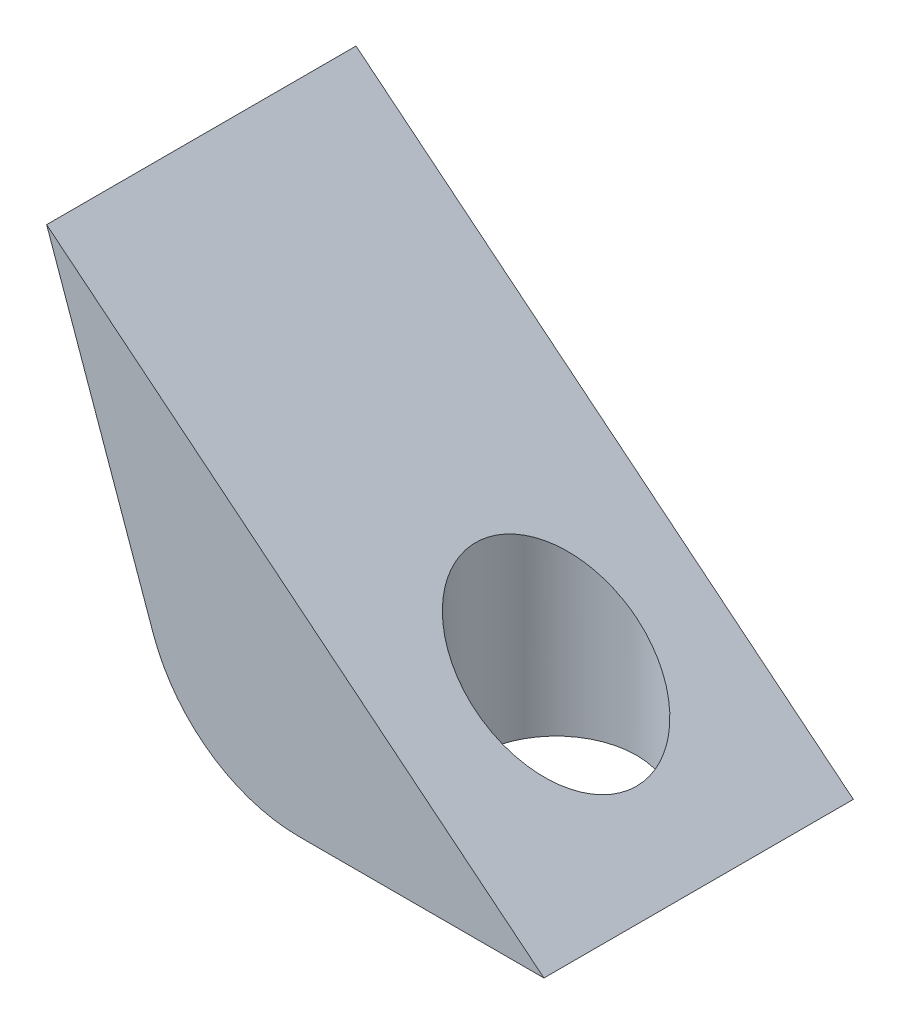
ISO-10303-21;
HEADER;
FILE_DESCRIPTION(('STEP AP214'),'2;1');
FILE_NAME('part.step','',(''),(''),'','','');
FILE_SCHEMA(('AUTOMOTIVE_DESIGN { 1 0 10303 214 1 1 1 1 }'));
ENDSEC;
DATA;
#1=APPLICATION_CONTEXT('core data for automotive mechanical design processes');
#2=APPLICATION_PROTOCOL_DEFINITION('international standard','automotive_design',2000,#1);
#3=PRODUCT_CONTEXT('',#1,'mechanical');
#4=PRODUCT('Part','Part','',(#3));
#5=PRODUCT_RELATED_PRODUCT_CATEGORY('part','',(#4));
#6=PRODUCT_DEFINITION_FORMATION('','',#4);
#7=PRODUCT_DEFINITION_CONTEXT('part definition',#1,'design');
#8=PRODUCT_DEFINITION('design','',#6,#7);
#9=PRODUCT_DEFINITION_SHAPE('','',#8);
#10=(LENGTH_UNIT() NAMED_UNIT(*) SI_UNIT(.MILLI.,.METRE.));
#11=(NAMED_UNIT(*) PLANE_ANGLE_UNIT() SI_UNIT($,.RADIAN.));
#12=(NAMED_UNIT(*) SI_UNIT($,.STERADIAN.) SOLID_ANGLE_UNIT());
#13=UNCERTAINTY_MEASURE_WITH_UNIT(LENGTH_MEASURE(1.E-05),#10,'distance_accuracy_value','');
#14=(GEOMETRIC_REPRESENTATION_CONTEXT(3) GLOBAL_UNCERTAINTY_ASSIGNED_CONTEXT((#13)) GLOBAL_UNIT_ASSIGNED_CONTEXT((#10,
#11,#12)) REPRESENTATION_CONTEXT('',''));
#15=CARTESIAN_POINT('',(0.,0.,0.));
#16=DIRECTION('',(0.,0.,1.));
#17=DIRECTION('',(1.,0.,0.));
#18=AXIS2_PLACEMENT_3D('',#15,#16,#17);
#19=CARTESIAN_POINT('',(0.,0.,10.));
#20=DIRECTION('',(0.942599536242421,0.333925312421165,0.));
#21=DIRECTION('',(-0.333925312421165,0.942599536242421,0.));
#22=AXIS2_PLACEMENT_3D('',#19,#20,#21);
#23=PLANE('',#22);
#24=DIRECTION('',(0.333925312421165,-0.942599536242421,0.));
#25=VECTOR('',#24,1.);
#26=CARTESIAN_POINT('',(0.,0.,0.));
#27=LINE('',#26,#25);
#28=CARTESIAN_POINT('',(-4.62309300985638,13.05,0.));
#29=VERTEX_POINT('',#28);
#30=CARTESIAN_POINT('',(-1.17981809662375,3.33037343789417,0.));
#31=VERTEX_POINT('',#30);
#32=EDGE_CURVE('E111',#29,#31,#27,.T.);
#33=ORIENTED_EDGE('',*,*,#32,.T.);
#34=DIRECTION('',(0.,0.,-1.));
#35=VECTOR('',#34,1.);
#36=CARTESIAN_POINT('',(-1.17981809662375,3.33037343789417,10.));
#37=LINE('',#36,#35);
#38=CARTESIAN_POINT('',(-1.17981809662375,3.33037343789417,10.));
#39=VERTEX_POINT('',#38);
#40=EDGE_CURVE('E48',#31,#39,#37,.F.);
#41=ORIENTED_EDGE('',*,*,#40,.T.);
#42=DIRECTION('',(0.333925312421165,-0.942599536242421,0.));
#43=VECTOR('',#42,1.);
#44=CARTESIAN_POINT('',(0.,0.,10.));
#45=LINE('',#44,#43);
#46=CARTESIAN_POINT('',(-4.62309300985638,13.05,10.));
#47=VERTEX_POINT('',#46);
#48=EDGE_CURVE('E91',#47,#39,#45,.T.);
#49=ORIENTED_EDGE('',*,*,#48,.F.);
#50=DIRECTION('',(0.,0.,-1.));
#51=VECTOR('',#50,1.);
#52=CARTESIAN_POINT('',(-4.62309300985638,13.05,10.));
#53=LINE('',#52,#51);
#54=EDGE_CURVE('E101',#47,#29,#53,.T.);
#55=ORIENTED_EDGE('',*,*,#54,.T.);
#56=EDGE_LOOP('',(#33,#41,#49,#55));
#57=FACE_BOUND('',#56,.T.);
#58=ADVANCED_FACE('F38',(#57),#23,.F.);
#59=CARTESIAN_POINT('',(0.,0.,10.));
#60=DIRECTION('',(0.,1.,0.));
#61=DIRECTION('',(0.,0.,1.));
#62=AXIS2_PLACEMENT_3D('',#59,#60,#61);
#63=PLANE('',#62);
#64=CARTESIAN_POINT('',(6.71317958458835,0.,4.87));
#65=DIRECTION('',(0.,-1.,0.));
#66=DIRECTION('',(0.,0.,-1.));
#67=AXIS2_PLACEMENT_3D('',#64,#65,#66);
#68=CIRCLE('',#67,2.6);
#69=CARTESIAN_POINT('',(6.71317958458835,0.,2.27));
#70=VERTEX_POINT('',#69);
#71=EDGE_CURVE('E128',#70,#70,#68,.T.);
#72=ORIENTED_EDGE('',*,*,#71,.F.);
#73=EDGE_LOOP('',(#72));
#74=FACE_BOUND('',#73,.T.);
#75=DIRECTION('',(1.,0.,0.));
#76=VECTOR('',#75,1.);
#77=CARTESIAN_POINT('',(0.,0.,10.));
#78=LINE('',#77,#76);
#79=CARTESIAN_POINT('',(3.53317958458836,0.,10.));
#80=VERTEX_POINT('',#79);
#81=CARTESIAN_POINT('',(11.45,0.,10.));
#82=VERTEX_POINT('',#81);
#83=EDGE_CURVE('E80',#80,#82,#78,.T.);
#84=ORIENTED_EDGE('',*,*,#83,.F.);
#85=DIRECTION('',(0.,0.,-1.));
#86=VECTOR('',#85,1.);
#87=CARTESIAN_POINT('',(3.53317958458836,0.,10.));
#88=LINE('',#87,#86);
#89=CARTESIAN_POINT('',(3.53317958458836,0.,0.));
#90=VERTEX_POINT('',#89);
#91=EDGE_CURVE('E100',#80,#90,#88,.T.);
#92=ORIENTED_EDGE('',*,*,#91,.T.);
#93=DIRECTION('',(1.,0.,0.));
#94=VECTOR('',#93,1.);
#95=CARTESIAN_POINT('',(0.,0.,0.));
#96=LINE('',#95,#94);
#97=CARTESIAN_POINT('',(11.45,0.,0.));
#98=VERTEX_POINT('',#97);
#99=EDGE_CURVE('E96',#90,#98,#96,.T.);
#100=ORIENTED_EDGE('',*,*,#99,.T.);
#101=DIRECTION('',(0.,0.,-1.));
#102=VECTOR('',#101,1.);
#103=CARTESIAN_POINT('',(11.45,0.,10.));
#104=LINE('',#103,#102);
#105=EDGE_CURVE('E94',#82,#98,#104,.T.);
#106=ORIENTED_EDGE('',*,*,#105,.F.);
#107=EDGE_LOOP('',(#84,#92,#100,#106));
#108=FACE_BOUND('',#107,.T.);
#109=ADVANCED_FACE('F95',(#74,#108),#63,.F.);
#110=CARTESIAN_POINT('',(-4.62309300985638,13.05,10.));
#111=DIRECTION('',(-0.630319450905653,-0.776335874354648,0.));
#112=DIRECTION('',(0.776335874354648,-0.630319450905653,0.));
#113=AXIS2_PLACEMENT_3D('',#110,#111,#112);
#114=PLANE('',#113);
#115=CARTESIAN_POINT('',(6.71317958458835,3.84589987647152,4.87));
#116=DIRECTION('',(-0.630319450905653,-0.776335874354648,0.));
#117=DIRECTION('',(0.776335874354648,-0.630319450905653,0.));
#118=AXIS2_PLACEMENT_3D('',#115,#116,#117);
#119=ELLIPSE('',#118,3.3490658951724,2.6);
#120=CARTESIAN_POINT('',(9.31317958458835,1.73491850037961,4.87));
#121=VERTEX_POINT('',#120);
#122=EDGE_CURVE('E42',#121,#121,#119,.T.);
#123=ORIENTED_EDGE('',*,*,#122,.T.);
#124=EDGE_LOOP('',(#123));
#125=FACE_BOUND('',#124,.T.);
#126=DIRECTION('',(-0.776335874354648,0.630319450905653,0.));
#127=VECTOR('',#126,1.);
#128=CARTESIAN_POINT('',(-4.62309300985638,13.05,0.));
#129=LINE('',#128,#127);
#130=EDGE_CURVE('E116',#98,#29,#129,.T.);
#131=ORIENTED_EDGE('',*,*,#130,.T.);
#132=ORIENTED_EDGE('',*,*,#54,.F.);
#133=DIRECTION('',(-0.776335874354648,0.630319450905653,0.));
#134=VECTOR('',#133,1.);
#135=CARTESIAN_POINT('',(-4.62309300985638,13.05,10.));
#136=LINE('',#135,#134);
#137=EDGE_CURVE('E84',#82,#47,#136,.T.);
#138=ORIENTED_EDGE('',*,*,#137,.F.);
#139=ORIENTED_EDGE('',*,*,#105,.T.);
#140=EDGE_LOOP('',(#131,#132,#138,#139));
#141=FACE_BOUND('',#140,.T.);
#142=ADVANCED_FACE('F103',(#125,#141),#114,.F.);
#143=CARTESIAN_POINT('',(0.,0.,10.));
#144=DIRECTION('',(0.,0.,-1.));
#145=DIRECTION('',(-1.,0.,0.));
#146=AXIS2_PLACEMENT_3D('',#143,#144,#145);
#147=PLANE('',#146);
#148=ORIENTED_EDGE('',*,*,#48,.T.);
#149=CARTESIAN_POINT('',(3.53317958458836,5.,10.));
#150=DIRECTION('',(0.,0.,-1.));
#151=DIRECTION('',(-1.,0.,0.));
#152=AXIS2_PLACEMENT_3D('',#149,#150,#151);
#153=CIRCLE('',#152,5.);
#154=EDGE_CURVE('E11',#39,#80,#153,.F.);
#155=ORIENTED_EDGE('',*,*,#154,.T.);
#156=ORIENTED_EDGE('',*,*,#83,.T.);
#157=ORIENTED_EDGE('',*,*,#137,.T.);
#158=EDGE_LOOP('',(#148,#155,#156,#157));
#159=FACE_BOUND('',#158,.T.);
#160=ADVANCED_FACE('F82',(#159),#147,.F.);
#161=CARTESIAN_POINT('',(0.,0.,0.));
#162=DIRECTION('',(0.,0.,-1.));
#163=DIRECTION('',(-1.,0.,0.));
#164=AXIS2_PLACEMENT_3D('',#161,#162,#163);
#165=PLANE('',#164);
#166=ORIENTED_EDGE('',*,*,#99,.F.);
#167=CARTESIAN_POINT('',(3.53317958458836,5.,0.));
#168=DIRECTION('',(0.,0.,-1.));
#169=DIRECTION('',(-1.,0.,0.));
#170=AXIS2_PLACEMENT_3D('',#167,#168,#169);
#171=CIRCLE('',#170,5.);
#172=EDGE_CURVE('E62',#90,#31,#171,.T.);
#173=ORIENTED_EDGE('',*,*,#172,.T.);
#174=ORIENTED_EDGE('',*,*,#32,.F.);
#175=ORIENTED_EDGE('',*,*,#130,.F.);
#176=EDGE_LOOP('',(#166,#173,#174,#175));
#177=FACE_BOUND('',#176,.T.);
#178=ADVANCED_FACE('F125',(#177),#165,.T.);
#179=CARTESIAN_POINT('',(3.53317958458836,5.,10.));
#180=DIRECTION('',(0.,0.,-1.));
#181=DIRECTION('',(-1.,0.,0.));
#182=AXIS2_PLACEMENT_3D('',#179,#180,#181);
#183=CYLINDRICAL_SURFACE('',#182,5.);
#184=ORIENTED_EDGE('',*,*,#154,.F.);
#185=ORIENTED_EDGE('',*,*,#40,.F.);
#186=ORIENTED_EDGE('',*,*,#172,.F.);
#187=ORIENTED_EDGE('',*,*,#91,.F.);
#188=EDGE_LOOP('',(#184,#185,#186,#187));
#189=FACE_BOUND('',#188,.T.);
#190=ADVANCED_FACE('F40',(#189),#183,.T.);
#191=CARTESIAN_POINT('',(6.71317958458835,10.,4.87));
#192=DIRECTION('',(0.,-1.,0.));
#193=DIRECTION('',(0.,0.,-1.));
#194=AXIS2_PLACEMENT_3D('',#191,#192,#193);
#195=CYLINDRICAL_SURFACE('',#194,2.6);
#196=ORIENTED_EDGE('',*,*,#71,.T.);
#197=EDGE_LOOP('',(#196));
#198=FACE_BOUND('',#197,.T.);
#199=ORIENTED_EDGE('',*,*,#122,.F.);
#200=EDGE_LOOP('',(#199));
#201=FACE_BOUND('',#200,.T.);
#202=ADVANCED_FACE('F138',(#198,#201),#195,.F.);
#203=CLOSED_SHELL('',(#58,#109,#142,#160,#178,#190,#202));
#204=MANIFOLD_SOLID_BREP('B2',#203);
#205=ADVANCED_BREP_SHAPE_REPRESENTATION('',(#18,#204),#14);
#206=SHAPE_DEFINITION_REPRESENTATION(#9,#205);
ENDSEC;
END-ISO-10303-21;
